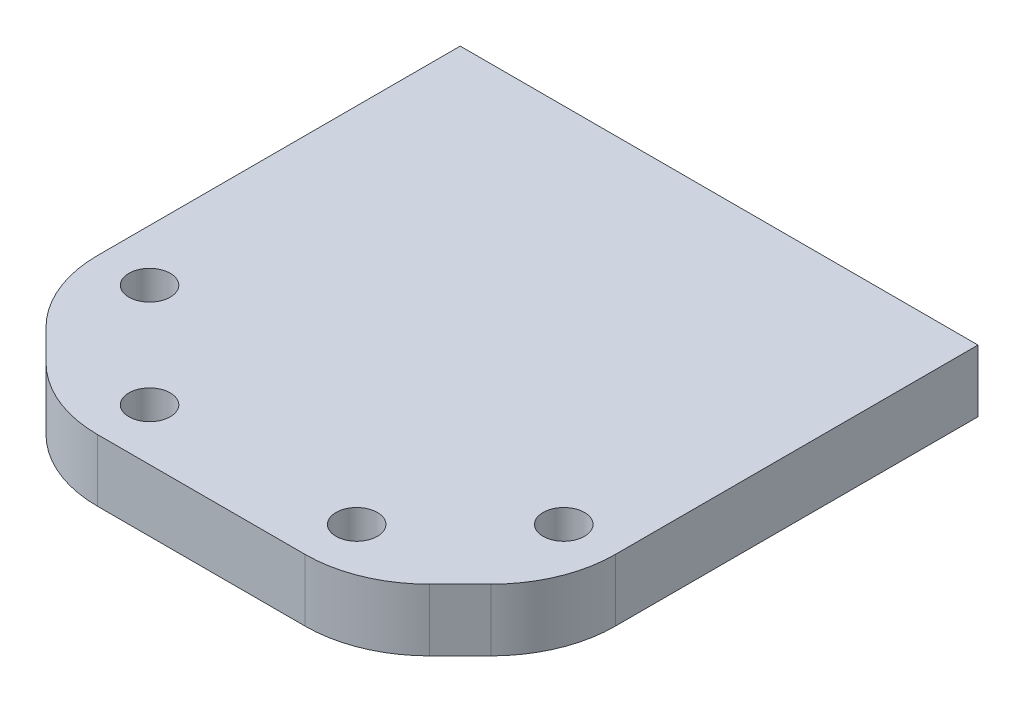
ISO-10303-21;
HEADER;
FILE_DESCRIPTION(('STEP AP214'),'2;1');
FILE_NAME('part.step','',(''),(''),'','','');
FILE_SCHEMA(('AUTOMOTIVE_DESIGN { 1 0 10303 214 1 1 1 1 }'));
ENDSEC;
DATA;
#1=APPLICATION_CONTEXT('core data for automotive mechanical design processes');
#2=APPLICATION_PROTOCOL_DEFINITION('international standard','automotive_design',2000,#1);
#3=PRODUCT_CONTEXT('',#1,'mechanical');
#4=PRODUCT('Part','Part','',(#3));
#5=PRODUCT_RELATED_PRODUCT_CATEGORY('part','',(#4));
#6=PRODUCT_DEFINITION_FORMATION('','',#4);
#7=PRODUCT_DEFINITION_CONTEXT('part definition',#1,'design');
#8=PRODUCT_DEFINITION('design','',#6,#7);
#9=PRODUCT_DEFINITION_SHAPE('','',#8);
#10=(LENGTH_UNIT() NAMED_UNIT(*) SI_UNIT(.MILLI.,.METRE.));
#11=(NAMED_UNIT(*) PLANE_ANGLE_UNIT() SI_UNIT($,.RADIAN.));
#12=(NAMED_UNIT(*) SI_UNIT($,.STERADIAN.) SOLID_ANGLE_UNIT());
#13=UNCERTAINTY_MEASURE_WITH_UNIT(LENGTH_MEASURE(1.E-05),#10,'distance_accuracy_value','');
#14=(GEOMETRIC_REPRESENTATION_CONTEXT(3) GLOBAL_UNCERTAINTY_ASSIGNED_CONTEXT((#13)) GLOBAL_UNIT_ASSIGNED_CONTEXT((#10,
#11,#12)) REPRESENTATION_CONTEXT('',''));
#15=CARTESIAN_POINT('',(0.,0.,0.));
#16=DIRECTION('',(0.,0.,1.));
#17=DIRECTION('',(1.,0.,0.));
#18=AXIS2_PLACEMENT_3D('',#15,#16,#17);
#19=CARTESIAN_POINT('',(12.5,-3.,-25.));
#20=DIRECTION('',(1.,0.,0.));
#21=DIRECTION('',(0.,0.,-1.));
#22=AXIS2_PLACEMENT_3D('',#19,#20,#21);
#23=PLANE('',#22);
#24=DIRECTION('',(0.,0.,-1.));
#25=VECTOR('',#24,1.);
#26=CARTESIAN_POINT('',(12.5,0.,-25.));
#27=LINE('',#26,#25);
#28=CARTESIAN_POINT('',(12.5,0.,-7.48528137423857));
#29=VERTEX_POINT('',#28);
#30=CARTESIAN_POINT('',(12.5,0.,-25.));
#31=VERTEX_POINT('',#30);
#32=EDGE_CURVE('E146',#29,#31,#27,.T.);
#33=ORIENTED_EDGE('',*,*,#32,.F.);
#34=DIRECTION('',(0.,1.,0.));
#35=VECTOR('',#34,1.);
#36=CARTESIAN_POINT('',(12.5,-3.,-7.48528137423857));
#37=LINE('',#36,#35);
#38=CARTESIAN_POINT('',(12.5,-3.,-7.48528137423857));
#39=VERTEX_POINT('',#38);
#40=EDGE_CURVE('E11',#39,#29,#37,.T.);
#41=ORIENTED_EDGE('',*,*,#40,.F.);
#42=DIRECTION('',(0.,0.,-1.));
#43=VECTOR('',#42,1.);
#44=CARTESIAN_POINT('',(12.5,-3.,-25.));
#45=LINE('',#44,#43);
#46=CARTESIAN_POINT('',(12.5,-3.,-25.));
#47=VERTEX_POINT('',#46);
#48=EDGE_CURVE('E173',#39,#47,#45,.T.);
#49=ORIENTED_EDGE('',*,*,#48,.T.);
#50=DIRECTION('',(0.,1.,0.));
#51=VECTOR('',#50,1.);
#52=CARTESIAN_POINT('',(12.5,-3.,-25.));
#53=LINE('',#52,#51);
#54=EDGE_CURVE('E40',#47,#31,#53,.T.);
#55=ORIENTED_EDGE('',*,*,#54,.T.);
#56=EDGE_LOOP('',(#33,#41,#49,#55));
#57=FACE_BOUND('',#56,.T.);
#58=ADVANCED_FACE('F37',(#57),#23,.T.);
#59=CARTESIAN_POINT('',(6.5,-3.,-7.48528137423857));
#60=DIRECTION('',(0.,1.,0.));
#61=DIRECTION('',(0.,0.,1.));
#62=AXIS2_PLACEMENT_3D('',#59,#60,#61);
#63=CYLINDRICAL_SURFACE('',#62,6.);
#64=CARTESIAN_POINT('',(6.5,0.,-7.48528137423857));
#65=DIRECTION('',(0.,1.,0.));
#66=DIRECTION('',(0.,0.,-1.));
#67=AXIS2_PLACEMENT_3D('',#64,#65,#66);
#68=CIRCLE('',#67,6.);
#69=CARTESIAN_POINT('',(10.7426406871193,0.,-3.24264068711929));
#70=VERTEX_POINT('',#69);
#71=EDGE_CURVE('E171',#70,#29,#68,.T.);
#72=ORIENTED_EDGE('',*,*,#71,.F.);
#73=DIRECTION('',(0.,1.,0.));
#74=VECTOR('',#73,1.);
#75=CARTESIAN_POINT('',(10.7426406871193,-3.,-3.24264068711929));
#76=LINE('',#75,#74);
#77=CARTESIAN_POINT('',(10.7426406871193,-3.,-3.24264068711929));
#78=VERTEX_POINT('',#77);
#79=EDGE_CURVE('E46',#78,#70,#76,.T.);
#80=ORIENTED_EDGE('',*,*,#79,.F.);
#81=CARTESIAN_POINT('',(6.5,-3.,-7.48528137423857));
#82=DIRECTION('',(0.,1.,0.));
#83=DIRECTION('',(0.,0.,-1.));
#84=AXIS2_PLACEMENT_3D('',#81,#82,#83);
#85=CIRCLE('',#84,6.);
#86=EDGE_CURVE('E136',#78,#39,#85,.T.);
#87=ORIENTED_EDGE('',*,*,#86,.T.);
#88=ORIENTED_EDGE('',*,*,#40,.T.);
#89=EDGE_LOOP('',(#72,#80,#87,#88));
#90=FACE_BOUND('',#89,.T.);
#91=ADVANCED_FACE('F189',(#90),#63,.T.);
#92=CARTESIAN_POINT('',(10.7426406871193,-3.,-3.24264068711929));
#93=DIRECTION('',(0.707106781186548,0.,0.707106781186547));
#94=DIRECTION('',(0.707106781186547,0.,-0.707106781186548));
#95=AXIS2_PLACEMENT_3D('',#92,#93,#94);
#96=PLANE('',#95);
#97=DIRECTION('',(0.707106781186547,0.,-0.707106781186548));
#98=VECTOR('',#97,1.);
#99=CARTESIAN_POINT('',(10.7426406871193,0.,-3.24264068711929));
#100=LINE('',#99,#98);
#101=CARTESIAN_POINT('',(9.25735931288072,0.,-1.75735931288072));
#102=VERTEX_POINT('',#101);
#103=EDGE_CURVE('E123',#102,#70,#100,.T.);
#104=ORIENTED_EDGE('',*,*,#103,.F.);
#105=DIRECTION('',(0.,1.,0.));
#106=VECTOR('',#105,1.);
#107=CARTESIAN_POINT('',(9.25735931288072,-3.,-1.75735931288072));
#108=LINE('',#107,#106);
#109=CARTESIAN_POINT('',(9.25735931288072,-3.,-1.75735931288072));
#110=VERTEX_POINT('',#109);
#111=EDGE_CURVE('E118',#110,#102,#108,.T.);
#112=ORIENTED_EDGE('',*,*,#111,.F.);
#113=DIRECTION('',(0.707106781186547,0.,-0.707106781186548));
#114=VECTOR('',#113,1.);
#115=CARTESIAN_POINT('',(10.7426406871193,-3.,-3.24264068711929));
#116=LINE('',#115,#114);
#117=EDGE_CURVE('E121',#110,#78,#116,.T.);
#118=ORIENTED_EDGE('',*,*,#117,.T.);
#119=ORIENTED_EDGE('',*,*,#79,.T.);
#120=EDGE_LOOP('',(#104,#112,#118,#119));
#121=FACE_BOUND('',#120,.T.);
#122=ADVANCED_FACE('F120',(#121),#96,.T.);
#123=CARTESIAN_POINT('',(5.01471862576143,-3.,-6.));
#124=DIRECTION('',(0.,1.,0.));
#125=DIRECTION('',(0.,0.,1.));
#126=AXIS2_PLACEMENT_3D('',#123,#124,#125);
#127=CYLINDRICAL_SURFACE('',#126,6.);
#128=CARTESIAN_POINT('',(5.01471862576143,0.,-6.));
#129=DIRECTION('',(0.,1.,0.));
#130=DIRECTION('',(0.,0.,1.));
#131=AXIS2_PLACEMENT_3D('',#128,#129,#130);
#132=CIRCLE('',#131,6.);
#133=CARTESIAN_POINT('',(5.01471862576143,0.,0.));
#134=VERTEX_POINT('',#133);
#135=EDGE_CURVE('E168',#134,#102,#132,.T.);
#136=ORIENTED_EDGE('',*,*,#135,.F.);
#137=DIRECTION('',(0.,1.,0.));
#138=VECTOR('',#137,1.);
#139=CARTESIAN_POINT('',(5.01471862576143,-3.,0.));
#140=LINE('',#139,#138);
#141=CARTESIAN_POINT('',(5.01471862576143,-3.,0.));
#142=VERTEX_POINT('',#141);
#143=EDGE_CURVE('E128',#142,#134,#140,.T.);
#144=ORIENTED_EDGE('',*,*,#143,.F.);
#145=CARTESIAN_POINT('',(5.01471862576143,-3.,-6.));
#146=DIRECTION('',(0.,1.,0.));
#147=DIRECTION('',(0.,0.,1.));
#148=AXIS2_PLACEMENT_3D('',#145,#146,#147);
#149=CIRCLE('',#148,6.);
#150=EDGE_CURVE('E134',#142,#110,#149,.T.);
#151=ORIENTED_EDGE('',*,*,#150,.T.);
#152=ORIENTED_EDGE('',*,*,#111,.T.);
#153=EDGE_LOOP('',(#136,#144,#151,#152));
#154=FACE_BOUND('',#153,.T.);
#155=ADVANCED_FACE('F138',(#154),#127,.T.);
#156=CARTESIAN_POINT('',(-5.01471862576143,-3.,0.));
#157=DIRECTION('',(0.,0.,1.));
#158=DIRECTION('',(1.,0.,0.));
#159=AXIS2_PLACEMENT_3D('',#156,#157,#158);
#160=PLANE('',#159);
#161=DIRECTION('',(1.,0.,0.));
#162=VECTOR('',#161,1.);
#163=CARTESIAN_POINT('',(-5.01471862576143,0.,0.));
#164=LINE('',#163,#162);
#165=CARTESIAN_POINT('',(-5.01471862576143,0.,0.));
#166=VERTEX_POINT('',#165);
#167=EDGE_CURVE('E165',#166,#134,#164,.T.);
#168=ORIENTED_EDGE('',*,*,#167,.F.);
#169=DIRECTION('',(0.,1.,0.));
#170=VECTOR('',#169,1.);
#171=CARTESIAN_POINT('',(-5.01471862576143,-3.,0.));
#172=LINE('',#171,#170);
#173=CARTESIAN_POINT('',(-5.01471862576143,-3.,0.));
#174=VERTEX_POINT('',#173);
#175=EDGE_CURVE('E177',#174,#166,#172,.T.);
#176=ORIENTED_EDGE('',*,*,#175,.F.);
#177=DIRECTION('',(1.,0.,0.));
#178=VECTOR('',#177,1.);
#179=CARTESIAN_POINT('',(-5.01471862576143,-3.,0.));
#180=LINE('',#179,#178);
#181=EDGE_CURVE('E139',#174,#142,#180,.T.);
#182=ORIENTED_EDGE('',*,*,#181,.T.);
#183=ORIENTED_EDGE('',*,*,#143,.T.);
#184=EDGE_LOOP('',(#168,#176,#182,#183));
#185=FACE_BOUND('',#184,.T.);
#186=ADVANCED_FACE('F202',(#185),#160,.T.);
#187=CARTESIAN_POINT('',(-5.01471862576143,-3.,-6.));
#188=DIRECTION('',(0.,1.,0.));
#189=DIRECTION('',(0.,0.,1.));
#190=AXIS2_PLACEMENT_3D('',#187,#188,#189);
#191=CYLINDRICAL_SURFACE('',#190,6.);
#192=CARTESIAN_POINT('',(-5.01471862576143,0.,-6.));
#193=DIRECTION('',(0.,1.,0.));
#194=DIRECTION('',(0.,0.,-1.));
#195=AXIS2_PLACEMENT_3D('',#192,#193,#194);
#196=CIRCLE('',#195,6.);
#197=CARTESIAN_POINT('',(-9.25735931288072,0.,-1.75735931288072));
#198=VERTEX_POINT('',#197);
#199=EDGE_CURVE('E162',#198,#166,#196,.T.);
#200=ORIENTED_EDGE('',*,*,#199,.F.);
#201=DIRECTION('',(0.,1.,0.));
#202=VECTOR('',#201,1.);
#203=CARTESIAN_POINT('',(-9.25735931288072,-3.,-1.75735931288072));
#204=LINE('',#203,#202);
#205=CARTESIAN_POINT('',(-9.25735931288072,-3.,-1.75735931288072));
#206=VERTEX_POINT('',#205);
#207=EDGE_CURVE('E179',#206,#198,#204,.T.);
#208=ORIENTED_EDGE('',*,*,#207,.F.);
#209=CARTESIAN_POINT('',(-5.01471862576143,-3.,-6.));
#210=DIRECTION('',(0.,1.,0.));
#211=DIRECTION('',(0.,0.,-1.));
#212=AXIS2_PLACEMENT_3D('',#209,#210,#211);
#213=CIRCLE('',#212,6.);
#214=EDGE_CURVE('E141',#206,#174,#213,.T.);
#215=ORIENTED_EDGE('',*,*,#214,.T.);
#216=ORIENTED_EDGE('',*,*,#175,.T.);
#217=EDGE_LOOP('',(#200,#208,#215,#216));
#218=FACE_BOUND('',#217,.T.);
#219=ADVANCED_FACE('F205',(#218),#191,.T.);
#220=CARTESIAN_POINT('',(-10.7426406871193,-3.,-3.24264068711929));
#221=DIRECTION('',(-0.707106781186548,0.,0.707106781186547));
#222=DIRECTION('',(0.707106781186547,0.,0.707106781186548));
#223=AXIS2_PLACEMENT_3D('',#220,#221,#222);
#224=PLANE('',#223);
#225=DIRECTION('',(0.707106781186547,0.,0.707106781186548));
#226=VECTOR('',#225,1.);
#227=CARTESIAN_POINT('',(-10.7426406871193,0.,-3.24264068711929));
#228=LINE('',#227,#226);
#229=CARTESIAN_POINT('',(-10.7426406871193,0.,-3.24264068711929));
#230=VERTEX_POINT('',#229);
#231=EDGE_CURVE('E159',#230,#198,#228,.T.);
#232=ORIENTED_EDGE('',*,*,#231,.F.);
#233=DIRECTION('',(0.,1.,0.));
#234=VECTOR('',#233,1.);
#235=CARTESIAN_POINT('',(-10.7426406871193,-3.,-3.24264068711929));
#236=LINE('',#235,#234);
#237=CARTESIAN_POINT('',(-10.7426406871193,-3.,-3.24264068711929));
#238=VERTEX_POINT('',#237);
#239=EDGE_CURVE('E181',#238,#230,#236,.T.);
#240=ORIENTED_EDGE('',*,*,#239,.F.);
#241=DIRECTION('',(0.707106781186547,0.,0.707106781186548));
#242=VECTOR('',#241,1.);
#243=CARTESIAN_POINT('',(-10.7426406871193,-3.,-3.24264068711929));
#244=LINE('',#243,#242);
#245=EDGE_CURVE('E285',#238,#206,#244,.T.);
#246=ORIENTED_EDGE('',*,*,#245,.T.);
#247=ORIENTED_EDGE('',*,*,#207,.T.);
#248=EDGE_LOOP('',(#232,#240,#246,#247));
#249=FACE_BOUND('',#248,.T.);
#250=ADVANCED_FACE('F209',(#249),#224,.T.);
#251=CARTESIAN_POINT('',(-6.5,-3.,-7.48528137423857));
#252=DIRECTION('',(0.,1.,0.));
#253=DIRECTION('',(0.,0.,1.));
#254=AXIS2_PLACEMENT_3D('',#251,#252,#253);
#255=CYLINDRICAL_SURFACE('',#254,6.);
#256=CARTESIAN_POINT('',(-6.5,0.,-7.48528137423857));
#257=DIRECTION('',(0.,1.,0.));
#258=DIRECTION('',(0.,0.,1.));
#259=AXIS2_PLACEMENT_3D('',#256,#257,#258);
#260=CIRCLE('',#259,6.);
#261=CARTESIAN_POINT('',(-12.5,0.,-7.48528137423857));
#262=VERTEX_POINT('',#261);
#263=EDGE_CURVE('E156',#262,#230,#260,.T.);
#264=ORIENTED_EDGE('',*,*,#263,.F.);
#265=DIRECTION('',(0.,1.,0.));
#266=VECTOR('',#265,1.);
#267=CARTESIAN_POINT('',(-12.5,-3.,-7.48528137423857));
#268=LINE('',#267,#266);
#269=CARTESIAN_POINT('',(-12.5,-3.,-7.48528137423857));
#270=VERTEX_POINT('',#269);
#271=EDGE_CURVE('E183',#270,#262,#268,.T.);
#272=ORIENTED_EDGE('',*,*,#271,.F.);
#273=CARTESIAN_POINT('',(-6.5,-3.,-7.48528137423857));
#274=DIRECTION('',(0.,1.,0.));
#275=DIRECTION('',(0.,0.,1.));
#276=AXIS2_PLACEMENT_3D('',#273,#274,#275);
#277=CIRCLE('',#276,6.);
#278=EDGE_CURVE('E282',#270,#238,#277,.T.);
#279=ORIENTED_EDGE('',*,*,#278,.T.);
#280=ORIENTED_EDGE('',*,*,#239,.T.);
#281=EDGE_LOOP('',(#264,#272,#279,#280));
#282=FACE_BOUND('',#281,.T.);
#283=ADVANCED_FACE('F213',(#282),#255,.T.);
#284=CARTESIAN_POINT('',(-12.5,-3.,-25.));
#285=DIRECTION('',(-1.,0.,0.));
#286=DIRECTION('',(0.,0.,1.));
#287=AXIS2_PLACEMENT_3D('',#284,#285,#286);
#288=PLANE('',#287);
#289=DIRECTION('',(0.,0.,1.));
#290=VECTOR('',#289,1.);
#291=CARTESIAN_POINT('',(-12.5,0.,-25.));
#292=LINE('',#291,#290);
#293=CARTESIAN_POINT('',(-12.5,0.,-25.));
#294=VERTEX_POINT('',#293);
#295=EDGE_CURVE('E153',#294,#262,#292,.T.);
#296=ORIENTED_EDGE('',*,*,#295,.F.);
#297=DIRECTION('',(0.,1.,0.));
#298=VECTOR('',#297,1.);
#299=CARTESIAN_POINT('',(-12.5,-3.,-25.));
#300=LINE('',#299,#298);
#301=CARTESIAN_POINT('',(-12.5,-3.,-25.));
#302=VERTEX_POINT('',#301);
#303=EDGE_CURVE('E184',#302,#294,#300,.T.);
#304=ORIENTED_EDGE('',*,*,#303,.F.);
#305=DIRECTION('',(0.,0.,1.));
#306=VECTOR('',#305,1.);
#307=CARTESIAN_POINT('',(-12.5,-3.,-25.));
#308=LINE('',#307,#306);
#309=EDGE_CURVE('E279',#302,#270,#308,.T.);
#310=ORIENTED_EDGE('',*,*,#309,.T.);
#311=ORIENTED_EDGE('',*,*,#271,.T.);
#312=EDGE_LOOP('',(#296,#304,#310,#311));
#313=FACE_BOUND('',#312,.T.);
#314=ADVANCED_FACE('F217',(#313),#288,.T.);
#315=CARTESIAN_POINT('',(12.5,-3.,-25.));
#316=DIRECTION('',(0.,0.,-1.));
#317=DIRECTION('',(-1.,0.,0.));
#318=AXIS2_PLACEMENT_3D('',#315,#316,#317);
#319=PLANE('',#318);
#320=DIRECTION('',(-1.,0.,0.));
#321=VECTOR('',#320,1.);
#322=CARTESIAN_POINT('',(12.5,0.,-25.));
#323=LINE('',#322,#321);
#324=EDGE_CURVE('E149',#31,#294,#323,.T.);
#325=ORIENTED_EDGE('',*,*,#324,.F.);
#326=ORIENTED_EDGE('',*,*,#54,.F.);
#327=DIRECTION('',(-1.,0.,0.));
#328=VECTOR('',#327,1.);
#329=CARTESIAN_POINT('',(12.5,-3.,-25.));
#330=LINE('',#329,#328);
#331=EDGE_CURVE('E277',#47,#302,#330,.T.);
#332=ORIENTED_EDGE('',*,*,#331,.T.);
#333=ORIENTED_EDGE('',*,*,#303,.T.);
#334=EDGE_LOOP('',(#325,#326,#332,#333));
#335=FACE_BOUND('',#334,.T.);
#336=ADVANCED_FACE('F186',(#335),#319,.T.);
#337=CARTESIAN_POINT('',(6.5,-3.,-7.48528137423857));
#338=DIRECTION('',(0.,-1.,0.));
#339=DIRECTION('',(0.,0.,-1.));
#340=AXIS2_PLACEMENT_3D('',#337,#338,#339);
#341=PLANE('',#340);
#342=CARTESIAN_POINT('',(5.,-3.,-2.5));
#343=DIRECTION('',(0.,1.,0.));
#344=DIRECTION('',(0.,0.,1.));
#345=AXIS2_PLACEMENT_3D('',#342,#343,#344);
#346=CIRCLE('',#345,0.999999999999998);
#347=CARTESIAN_POINT('',(5.,-3.,-1.5));
#348=VERTEX_POINT('',#347);
#349=EDGE_CURVE('E252',#348,#348,#346,.T.);
#350=ORIENTED_EDGE('',*,*,#349,.T.);
#351=EDGE_LOOP('',(#350));
#352=FACE_BOUND('',#351,.T.);
#353=CARTESIAN_POINT('',(10.,-3.,-7.5));
#354=DIRECTION('',(0.,1.,0.));
#355=DIRECTION('',(0.,0.,1.));
#356=AXIS2_PLACEMENT_3D('',#353,#354,#355);
#357=CIRCLE('',#356,0.999999999999998);
#358=CARTESIAN_POINT('',(10.,-3.,-6.5));
#359=VERTEX_POINT('',#358);
#360=EDGE_CURVE('E260',#359,#359,#357,.T.);
#361=ORIENTED_EDGE('',*,*,#360,.T.);
#362=EDGE_LOOP('',(#361));
#363=FACE_BOUND('',#362,.T.);
#364=CARTESIAN_POINT('',(-5.,-3.,-2.5));
#365=DIRECTION('',(0.,1.,0.));
#366=DIRECTION('',(0.,0.,1.));
#367=AXIS2_PLACEMENT_3D('',#364,#365,#366);
#368=CIRCLE('',#367,1.);
#369=CARTESIAN_POINT('',(-5.,-3.,-1.5));
#370=VERTEX_POINT('',#369);
#371=EDGE_CURVE('E266',#370,#370,#368,.T.);
#372=ORIENTED_EDGE('',*,*,#371,.T.);
#373=EDGE_LOOP('',(#372));
#374=FACE_BOUND('',#373,.T.);
#375=CARTESIAN_POINT('',(-10.,-3.,-7.5));
#376=DIRECTION('',(0.,1.,0.));
#377=DIRECTION('',(0.,0.,1.));
#378=AXIS2_PLACEMENT_3D('',#375,#376,#377);
#379=CIRCLE('',#378,0.999999999999998);
#380=CARTESIAN_POINT('',(-10.,-3.,-6.5));
#381=VERTEX_POINT('',#380);
#382=EDGE_CURVE('E150',#381,#381,#379,.T.);
#383=ORIENTED_EDGE('',*,*,#382,.T.);
#384=EDGE_LOOP('',(#383));
#385=FACE_BOUND('',#384,.T.);
#386=ORIENTED_EDGE('',*,*,#48,.F.);
#387=ORIENTED_EDGE('',*,*,#86,.F.);
#388=ORIENTED_EDGE('',*,*,#117,.F.);
#389=ORIENTED_EDGE('',*,*,#150,.F.);
#390=ORIENTED_EDGE('',*,*,#181,.F.);
#391=ORIENTED_EDGE('',*,*,#214,.F.);
#392=ORIENTED_EDGE('',*,*,#245,.F.);
#393=ORIENTED_EDGE('',*,*,#278,.F.);
#394=ORIENTED_EDGE('',*,*,#309,.F.);
#395=ORIENTED_EDGE('',*,*,#331,.F.);
#396=EDGE_LOOP('',(#386,#387,#388,#389,#390,#391,#392,#393,#394,#395));
#397=FACE_BOUND('',#396,.T.);
#398=ADVANCED_FACE('F132',(#352,#363,#374,#385,#397),#341,.T.);
#399=CARTESIAN_POINT('',(6.5,0.,-7.48528137423857));
#400=DIRECTION('',(0.,-1.,0.));
#401=DIRECTION('',(0.,0.,-1.));
#402=AXIS2_PLACEMENT_3D('',#399,#400,#401);
#403=PLANE('',#402);
#404=CARTESIAN_POINT('',(5.,0.,-2.5));
#405=DIRECTION('',(0.,1.,0.));
#406=DIRECTION('',(0.,0.,1.));
#407=AXIS2_PLACEMENT_3D('',#404,#405,#406);
#408=CIRCLE('',#407,0.999999999999998);
#409=CARTESIAN_POINT('',(5.,0.,-1.5));
#410=VERTEX_POINT('',#409);
#411=EDGE_CURVE('E255',#410,#410,#408,.T.);
#412=ORIENTED_EDGE('',*,*,#411,.F.);
#413=EDGE_LOOP('',(#412));
#414=FACE_BOUND('',#413,.T.);
#415=CARTESIAN_POINT('',(10.,0.,-7.5));
#416=DIRECTION('',(0.,1.,0.));
#417=DIRECTION('',(0.,0.,1.));
#418=AXIS2_PLACEMENT_3D('',#415,#416,#417);
#419=CIRCLE('',#418,0.999999999999998);
#420=CARTESIAN_POINT('',(10.,0.,-6.5));
#421=VERTEX_POINT('',#420);
#422=EDGE_CURVE('E257',#421,#421,#419,.T.);
#423=ORIENTED_EDGE('',*,*,#422,.F.);
#424=EDGE_LOOP('',(#423));
#425=FACE_BOUND('',#424,.T.);
#426=CARTESIAN_POINT('',(-5.,0.,-2.5));
#427=DIRECTION('',(0.,1.,0.));
#428=DIRECTION('',(0.,0.,1.));
#429=AXIS2_PLACEMENT_3D('',#426,#427,#428);
#430=CIRCLE('',#429,1.);
#431=CARTESIAN_POINT('',(-5.,0.,-1.5));
#432=VERTEX_POINT('',#431);
#433=EDGE_CURVE('E263',#432,#432,#430,.T.);
#434=ORIENTED_EDGE('',*,*,#433,.F.);
#435=EDGE_LOOP('',(#434));
#436=FACE_BOUND('',#435,.T.);
#437=CARTESIAN_POINT('',(-10.,0.,-7.5));
#438=DIRECTION('',(0.,1.,0.));
#439=DIRECTION('',(0.,0.,1.));
#440=AXIS2_PLACEMENT_3D('',#437,#438,#439);
#441=CIRCLE('',#440,0.999999999999998);
#442=CARTESIAN_POINT('',(-10.,0.,-6.5));
#443=VERTEX_POINT('',#442);
#444=EDGE_CURVE('E269',#443,#443,#441,.T.);
#445=ORIENTED_EDGE('',*,*,#444,.F.);
#446=EDGE_LOOP('',(#445));
#447=FACE_BOUND('',#446,.T.);
#448=ORIENTED_EDGE('',*,*,#32,.T.);
#449=ORIENTED_EDGE('',*,*,#324,.T.);
#450=ORIENTED_EDGE('',*,*,#295,.T.);
#451=ORIENTED_EDGE('',*,*,#263,.T.);
#452=ORIENTED_EDGE('',*,*,#231,.T.);
#453=ORIENTED_EDGE('',*,*,#199,.T.);
#454=ORIENTED_EDGE('',*,*,#167,.T.);
#455=ORIENTED_EDGE('',*,*,#135,.T.);
#456=ORIENTED_EDGE('',*,*,#103,.T.);
#457=ORIENTED_EDGE('',*,*,#71,.T.);
#458=EDGE_LOOP('',(#448,#449,#450,#451,#452,#453,#454,#455,#456,#457));
#459=FACE_BOUND('',#458,.T.);
#460=ADVANCED_FACE('F188',(#414,#425,#436,#447,#459),#403,.F.);
#461=CARTESIAN_POINT('',(-10.,-3.,-7.5));
#462=DIRECTION('',(0.,1.,0.));
#463=DIRECTION('',(0.,0.,1.));
#464=AXIS2_PLACEMENT_3D('',#461,#462,#463);
#465=CYLINDRICAL_SURFACE('',#464,0.999999999999998);
#466=ORIENTED_EDGE('',*,*,#382,.F.);
#467=EDGE_LOOP('',(#466));
#468=FACE_BOUND('',#467,.T.);
#469=ORIENTED_EDGE('',*,*,#444,.T.);
#470=EDGE_LOOP('',(#469));
#471=FACE_BOUND('',#470,.T.);
#472=ADVANCED_FACE('F229',(#468,#471),#465,.F.);
#473=CARTESIAN_POINT('',(-5.,-3.,-2.5));
#474=DIRECTION('',(0.,1.,0.));
#475=DIRECTION('',(0.,0.,1.));
#476=AXIS2_PLACEMENT_3D('',#473,#474,#475);
#477=CYLINDRICAL_SURFACE('',#476,1.);
#478=ORIENTED_EDGE('',*,*,#371,.F.);
#479=EDGE_LOOP('',(#478));
#480=FACE_BOUND('',#479,.T.);
#481=ORIENTED_EDGE('',*,*,#433,.T.);
#482=EDGE_LOOP('',(#481));
#483=FACE_BOUND('',#482,.T.);
#484=ADVANCED_FACE('F236',(#480,#483),#477,.F.);
#485=CARTESIAN_POINT('',(10.,-3.,-7.5));
#486=DIRECTION('',(0.,1.,0.));
#487=DIRECTION('',(0.,0.,1.));
#488=AXIS2_PLACEMENT_3D('',#485,#486,#487);
#489=CYLINDRICAL_SURFACE('',#488,0.999999999999998);
#490=ORIENTED_EDGE('',*,*,#360,.F.);
#491=EDGE_LOOP('',(#490));
#492=FACE_BOUND('',#491,.T.);
#493=ORIENTED_EDGE('',*,*,#422,.T.);
#494=EDGE_LOOP('',(#493));
#495=FACE_BOUND('',#494,.T.);
#496=ADVANCED_FACE('F240',(#492,#495),#489,.F.);
#497=CARTESIAN_POINT('',(5.,-3.,-2.5));
#498=DIRECTION('',(0.,1.,0.));
#499=DIRECTION('',(0.,0.,1.));
#500=AXIS2_PLACEMENT_3D('',#497,#498,#499);
#501=CYLINDRICAL_SURFACE('',#500,0.999999999999998);
#502=ORIENTED_EDGE('',*,*,#349,.F.);
#503=EDGE_LOOP('',(#502));
#504=FACE_BOUND('',#503,.T.);
#505=ORIENTED_EDGE('',*,*,#411,.T.);
#506=EDGE_LOOP('',(#505));
#507=FACE_BOUND('',#506,.T.);
#508=ADVANCED_FACE('F244',(#504,#507),#501,.F.);
#509=CLOSED_SHELL('',(#58,#91,#122,#155,#186,#219,#250,#283,#314,#336,#398,#460,#472,#484,#496,#508));
#510=MANIFOLD_SOLID_BREP('B2',#509);
#511=ADVANCED_BREP_SHAPE_REPRESENTATION('',(#18,#510),#14);
#512=SHAPE_DEFINITION_REPRESENTATION(#9,#511);
ENDSEC;
END-ISO-10303-21;
